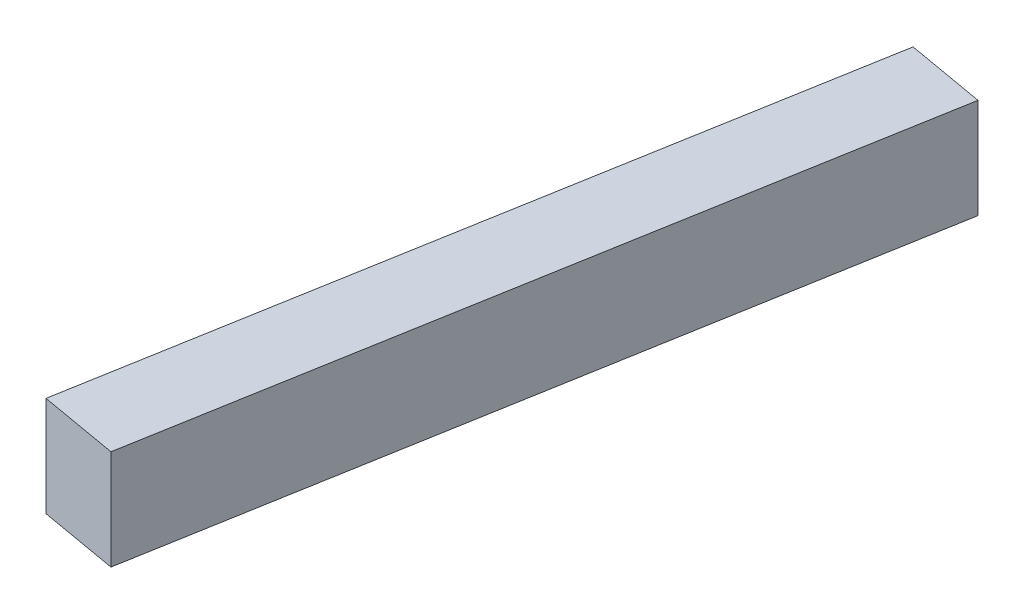
ISO-10303-21;
HEADER;
FILE_DESCRIPTION(('STEP AP214'),'2;1');
FILE_NAME('part.step','',(''),(''),'','','');
FILE_SCHEMA(('AUTOMOTIVE_DESIGN { 1 0 10303 214 1 1 1 1 }'));
ENDSEC;
DATA;
#1=APPLICATION_CONTEXT('core data for automotive mechanical design processes');
#2=APPLICATION_PROTOCOL_DEFINITION('international standard','automotive_design',2000,#1);
#3=PRODUCT_CONTEXT('',#1,'mechanical');
#4=PRODUCT('Part','Part','',(#3));
#5=PRODUCT_RELATED_PRODUCT_CATEGORY('part','',(#4));
#6=PRODUCT_DEFINITION_FORMATION('','',#4);
#7=PRODUCT_DEFINITION_CONTEXT('part definition',#1,'design');
#8=PRODUCT_DEFINITION('design','',#6,#7);
#9=PRODUCT_DEFINITION_SHAPE('','',#8);
#10=(LENGTH_UNIT() NAMED_UNIT(*) SI_UNIT(.MILLI.,.METRE.));
#11=(NAMED_UNIT(*) PLANE_ANGLE_UNIT() SI_UNIT($,.RADIAN.));
#12=(NAMED_UNIT(*) SI_UNIT($,.STERADIAN.) SOLID_ANGLE_UNIT());
#13=UNCERTAINTY_MEASURE_WITH_UNIT(LENGTH_MEASURE(1.E-05),#10,'distance_accuracy_value','');
#14=(GEOMETRIC_REPRESENTATION_CONTEXT(3) GLOBAL_UNCERTAINTY_ASSIGNED_CONTEXT((#13)) GLOBAL_UNIT_ASSIGNED_CONTEXT((#10,
#11,#12)) REPRESENTATION_CONTEXT('',''));
#15=CARTESIAN_POINT('',(0.,0.,0.));
#16=DIRECTION('',(0.,0.,1.));
#17=DIRECTION('',(1.,0.,0.));
#18=AXIS2_PLACEMENT_3D('',#15,#16,#17);
#19=CARTESIAN_POINT('',(3.00465904024544,7.874,-17.7449362360088));
#20=DIRECTION('',(0.985023181963942,0.,0.17242195624001));
#21=DIRECTION('',(0.17242195624001,0.,-0.985023181963941));
#22=AXIS2_PLACEMENT_3D('',#19,#20,#21);
#23=PLANE('',#22);
#24=DIRECTION('',(0.,1.,0.));
#25=VECTOR('',#24,1.);
#26=CARTESIAN_POINT('',(3.00465904024544,7.874,-17.7449362360088));
#27=LINE('',#26,#25);
#28=CARTESIAN_POINT('',(3.00465904024544,7.62,-17.7449362360088));
#29=VERTEX_POINT('',#28);
#30=CARTESIAN_POINT('',(3.00465904024544,7.874,-17.7449362360088));
#31=VERTEX_POINT('',#30);
#32=EDGE_CURVE('E20',#29,#31,#27,.T.);
#33=ORIENTED_EDGE('',*,*,#32,.T.);
#34=DIRECTION('',(0.172421956240011,0.,-0.985023181963941));
#35=VECTOR('',#34,1.);
#36=CARTESIAN_POINT('',(3.00465904024544,7.874,-17.7449362360088));
#37=LINE('',#36,#35);
#38=CARTESIAN_POINT('',(3.33312286688266,7.874,-19.6214053976501));
#39=VERTEX_POINT('',#38);
#40=EDGE_CURVE('E55',#31,#39,#37,.T.);
#41=ORIENTED_EDGE('',*,*,#40,.T.);
#42=DIRECTION('',(0.,1.,0.));
#43=VECTOR('',#42,1.);
#44=CARTESIAN_POINT('',(3.33312286688266,7.874,-19.6214053976501));
#45=LINE('',#44,#43);
#46=CARTESIAN_POINT('',(3.33312286688266,7.62,-19.6214053976501));
#47=VERTEX_POINT('',#46);
#48=EDGE_CURVE('E76',#39,#47,#45,.F.);
#49=ORIENTED_EDGE('',*,*,#48,.T.);
#50=DIRECTION('',(0.172421956240011,0.,-0.985023181963941));
#51=VECTOR('',#50,1.);
#52=CARTESIAN_POINT('',(3.00465904024544,7.62,-17.7449362360088));
#53=LINE('',#52,#51);
#54=EDGE_CURVE('E58',#29,#47,#53,.T.);
#55=ORIENTED_EDGE('',*,*,#54,.F.);
#56=EDGE_LOOP('',(#33,#41,#49,#55));
#57=FACE_BOUND('',#56,.T.);
#58=ADVANCED_FACE('F17',(#57),#23,.F.);
#59=CARTESIAN_POINT('',(3.00465904024544,7.874,-17.7449362360088));
#60=DIRECTION('',(0.172421956240009,0.,-0.985023181963942));
#61=DIRECTION('',(-0.985023181963942,0.,-0.172421956240009));
#62=AXIS2_PLACEMENT_3D('',#59,#60,#61);
#63=PLANE('',#62);
#64=DIRECTION('',(0.,1.,0.));
#65=VECTOR('',#64,1.);
#66=CARTESIAN_POINT('',(3.20481575082052,7.874,-17.7099000945008));
#67=LINE('',#66,#65);
#68=CARTESIAN_POINT('',(3.20481575082052,7.62,-17.7099000945008));
#69=VERTEX_POINT('',#68);
#70=CARTESIAN_POINT('',(3.20481575082052,7.874,-17.7099000945008));
#71=VERTEX_POINT('',#70);
#72=EDGE_CURVE('E73',#69,#71,#67,.T.);
#73=ORIENTED_EDGE('',*,*,#72,.T.);
#74=DIRECTION('',(-0.985023181963916,0.,-0.172421956240156));
#75=VECTOR('',#74,1.);
#76=CARTESIAN_POINT('',(3.20481575082052,7.874,-17.7099000945008));
#77=LINE('',#76,#75);
#78=EDGE_CURVE('E63',#71,#31,#77,.T.);
#79=ORIENTED_EDGE('',*,*,#78,.T.);
#80=ORIENTED_EDGE('',*,*,#32,.F.);
#81=DIRECTION('',(-0.985023181963916,0.,-0.172421956240156));
#82=VECTOR('',#81,1.);
#83=CARTESIAN_POINT('',(3.20481575082052,7.62,-17.7099000945008));
#84=LINE('',#83,#82);
#85=EDGE_CURVE('E80',#69,#29,#84,.T.);
#86=ORIENTED_EDGE('',*,*,#85,.F.);
#87=EDGE_LOOP('',(#73,#79,#80,#86));
#88=FACE_BOUND('',#87,.T.);
#89=ADVANCED_FACE('F72',(#88),#63,.F.);
#90=CARTESIAN_POINT('',(3.00465904024544,7.874,-17.7449362360088));
#91=DIRECTION('',(0.,-1.,0.));
#92=DIRECTION('',(0.,0.,-1.));
#93=AXIS2_PLACEMENT_3D('',#90,#91,#92);
#94=PLANE('',#93);
#95=ORIENTED_EDGE('',*,*,#78,.F.);
#96=DIRECTION('',(-0.172421956240011,0.,0.985023181963941));
#97=VECTOR('',#96,1.);
#98=CARTESIAN_POINT('',(3.20481575082052,7.874,-17.7099000945008));
#99=LINE('',#98,#97);
#100=CARTESIAN_POINT('',(3.53327957751108,7.874,-19.5863692564468));
#101=VERTEX_POINT('',#100);
#102=EDGE_CURVE('E83',#71,#101,#99,.F.);
#103=ORIENTED_EDGE('',*,*,#102,.T.);
#104=DIRECTION('',(0.985023182226425,0.,0.172421954740479));
#105=VECTOR('',#104,1.);
#106=CARTESIAN_POINT('',(3.33312286688266,7.874,-19.6214053976501));
#107=LINE('',#106,#105);
#108=EDGE_CURVE('E69',#101,#39,#107,.F.);
#109=ORIENTED_EDGE('',*,*,#108,.T.);
#110=ORIENTED_EDGE('',*,*,#40,.F.);
#111=EDGE_LOOP('',(#95,#103,#109,#110));
#112=FACE_BOUND('',#111,.T.);
#113=ADVANCED_FACE('F66',(#112),#94,.F.);
#114=CARTESIAN_POINT('',(3.33312286688266,7.874,-19.6214053976501));
#115=DIRECTION('',(-0.172421954740479,0.,0.985023182226425));
#116=DIRECTION('',(0.985023182226425,0.,0.172421954740479));
#117=AXIS2_PLACEMENT_3D('',#114,#115,#116);
#118=PLANE('',#117);
#119=ORIENTED_EDGE('',*,*,#48,.F.);
#120=ORIENTED_EDGE('',*,*,#108,.F.);
#121=DIRECTION('',(0.,1.,0.));
#122=VECTOR('',#121,1.);
#123=CARTESIAN_POINT('',(3.53327957751108,7.874,-19.5863692564468));
#124=LINE('',#123,#122);
#125=CARTESIAN_POINT('',(3.53327957751108,7.62,-19.5863692564468));
#126=VERTEX_POINT('',#125);
#127=EDGE_CURVE('E26',#101,#126,#124,.F.);
#128=ORIENTED_EDGE('',*,*,#127,.T.);
#129=DIRECTION('',(0.985023182226396,0.,0.172421954740641));
#130=VECTOR('',#129,1.);
#131=CARTESIAN_POINT('',(3.33312286688266,7.62,-19.6214053976501));
#132=LINE('',#131,#130);
#133=EDGE_CURVE('E34',#47,#126,#132,.T.);
#134=ORIENTED_EDGE('',*,*,#133,.F.);
#135=EDGE_LOOP('',(#119,#120,#128,#134));
#136=FACE_BOUND('',#135,.T.);
#137=ADVANCED_FACE('F88',(#136),#118,.F.);
#138=CARTESIAN_POINT('',(3.00465904024544,7.62,-17.7449362360088));
#139=DIRECTION('',(0.,-1.,0.));
#140=DIRECTION('',(0.,0.,-1.));
#141=AXIS2_PLACEMENT_3D('',#138,#139,#140);
#142=PLANE('',#141);
#143=DIRECTION('',(-0.172421956240011,0.,0.985023181963941));
#144=VECTOR('',#143,1.);
#145=CARTESIAN_POINT('',(3.20481575082052,7.62,-17.7099000945008));
#146=LINE('',#145,#144);
#147=EDGE_CURVE('E11',#126,#69,#146,.T.);
#148=ORIENTED_EDGE('',*,*,#147,.T.);
#149=ORIENTED_EDGE('',*,*,#85,.T.);
#150=ORIENTED_EDGE('',*,*,#54,.T.);
#151=ORIENTED_EDGE('',*,*,#133,.T.);
#152=EDGE_LOOP('',(#148,#149,#150,#151));
#153=FACE_BOUND('',#152,.T.);
#154=ADVANCED_FACE('F91',(#153),#142,.T.);
#155=CARTESIAN_POINT('',(3.20481575082052,7.874,-17.7099000945008));
#156=DIRECTION('',(-0.985023181963941,0.,-0.172421956240011));
#157=DIRECTION('',(-0.172421956240011,0.,0.985023181963941));
#158=AXIS2_PLACEMENT_3D('',#155,#156,#157);
#159=PLANE('',#158);
#160=ORIENTED_EDGE('',*,*,#127,.F.);
#161=ORIENTED_EDGE('',*,*,#102,.F.);
#162=ORIENTED_EDGE('',*,*,#72,.F.);
#163=ORIENTED_EDGE('',*,*,#147,.F.);
#164=EDGE_LOOP('',(#160,#161,#162,#163));
#165=FACE_BOUND('',#164,.T.);
#166=ADVANCED_FACE('F90',(#165),#159,.F.);
#167=CLOSED_SHELL('',(#58,#89,#113,#137,#154,#166));
#168=MANIFOLD_SOLID_BREP('B1',#167);
#169=ADVANCED_BREP_SHAPE_REPRESENTATION('',(#18,#168),#14);
#170=SHAPE_DEFINITION_REPRESENTATION(#9,#169);
ENDSEC;
END-ISO-10303-21;
